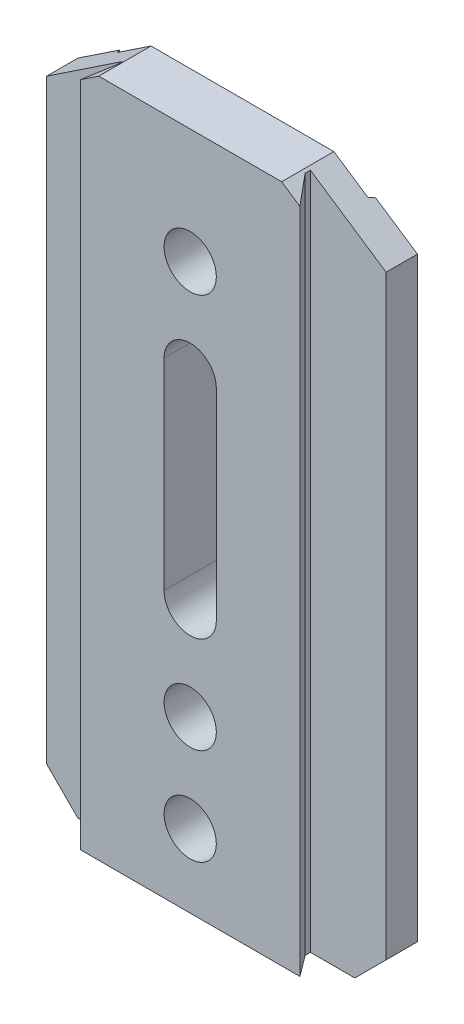
ISO-10303-21;
HEADER;
FILE_DESCRIPTION(('STEP AP214'),'2;1');
FILE_NAME('part.step','',(''),(''),'','','');
FILE_SCHEMA(('AUTOMOTIVE_DESIGN { 1 0 10303 214 1 1 1 1 }'));
ENDSEC;
DATA;
#1=APPLICATION_CONTEXT('core data for automotive mechanical design processes');
#2=APPLICATION_PROTOCOL_DEFINITION('international standard','automotive_design',2000,#1);
#3=PRODUCT_CONTEXT('',#1,'mechanical');
#4=PRODUCT('Part','Part','',(#3));
#5=PRODUCT_RELATED_PRODUCT_CATEGORY('part','',(#4));
#6=PRODUCT_DEFINITION_FORMATION('','',#4);
#7=PRODUCT_DEFINITION_CONTEXT('part definition',#1,'design');
#8=PRODUCT_DEFINITION('design','',#6,#7);
#9=PRODUCT_DEFINITION_SHAPE('','',#8);
#10=(LENGTH_UNIT() NAMED_UNIT(*) SI_UNIT(.MILLI.,.METRE.));
#11=(NAMED_UNIT(*) PLANE_ANGLE_UNIT() SI_UNIT($,.RADIAN.));
#12=(NAMED_UNIT(*) SI_UNIT($,.STERADIAN.) SOLID_ANGLE_UNIT());
#13=UNCERTAINTY_MEASURE_WITH_UNIT(LENGTH_MEASURE(1.E-05),#10,'distance_accuracy_value','');
#14=(GEOMETRIC_REPRESENTATION_CONTEXT(3) GLOBAL_UNCERTAINTY_ASSIGNED_CONTEXT((#13)) GLOBAL_UNIT_ASSIGNED_CONTEXT((#10,
#11,#12)) REPRESENTATION_CONTEXT('',''));
#15=CARTESIAN_POINT('',(0.,0.,0.));
#16=DIRECTION('',(0.,0.,1.));
#17=DIRECTION('',(1.,0.,0.));
#18=AXIS2_PLACEMENT_3D('',#15,#16,#17);
#19=CARTESIAN_POINT('',(0.,0.,0.));
#20=DIRECTION('',(0.,0.,1.));
#21=DIRECTION('',(1.,0.,0.));
#22=AXIS2_PLACEMENT_3D('',#19,#20,#21);
#23=PLANE('',#22);
#24=DIRECTION('',(0.832050294337844,0.554700196225229,0.));
#25=VECTOR('',#24,1.);
#26=CARTESIAN_POINT('',(-32.5,55.,0.));
#27=LINE('',#26,#25);
#28=CARTESIAN_POINT('',(-32.5,55.,0.));
#29=VERTEX_POINT('',#28);
#30=CARTESIAN_POINT('',(-24.5,60.3333333333333,0.));
#31=VERTEX_POINT('',#30);
#32=EDGE_CURVE('E209',#29,#31,#27,.T.);
#33=ORIENTED_EDGE('',*,*,#32,.T.);
#34=DIRECTION('',(0.,-1.,0.));
#35=VECTOR('',#34,1.);
#36=CARTESIAN_POINT('',(-24.5,65.,0.));
#37=LINE('',#36,#35);
#38=CARTESIAN_POINT('',(-24.5,-65.,0.));
#39=VERTEX_POINT('',#38);
#40=EDGE_CURVE('E196',#31,#39,#37,.T.);
#41=ORIENTED_EDGE('',*,*,#40,.T.);
#42=DIRECTION('',(1.,0.,0.));
#43=VECTOR('',#42,1.);
#44=CARTESIAN_POINT('',(-32.5,-65.,0.));
#45=LINE('',#44,#43);
#46=CARTESIAN_POINT('',(-26.5,-65.,0.));
#47=VERTEX_POINT('',#46);
#48=EDGE_CURVE('E207',#47,#39,#45,.T.);
#49=ORIENTED_EDGE('',*,*,#48,.F.);
#50=DIRECTION('',(-0.707106781186549,0.707106781186546,0.));
#51=VECTOR('',#50,1.);
#52=CARTESIAN_POINT('',(-26.5,-65.,0.));
#53=LINE('',#52,#51);
#54=CARTESIAN_POINT('',(-32.5,-59.,0.));
#55=VERTEX_POINT('',#54);
#56=EDGE_CURVE('E294',#47,#55,#53,.T.);
#57=ORIENTED_EDGE('',*,*,#56,.T.);
#58=DIRECTION('',(0.,-1.,0.));
#59=VECTOR('',#58,1.);
#60=CARTESIAN_POINT('',(-32.5,65.,0.));
#61=LINE('',#60,#59);
#62=EDGE_CURVE('E223',#29,#55,#61,.T.);
#63=ORIENTED_EDGE('',*,*,#62,.F.);
#64=EDGE_LOOP('',(#33,#41,#49,#57,#63));
#65=FACE_BOUND('',#64,.T.);
#66=ADVANCED_FACE('F45',(#65),#23,.F.);
#67=CARTESIAN_POINT('',(-32.5,65.,11.));
#68=DIRECTION('',(1.,0.,0.));
#69=DIRECTION('',(0.,1.,0.));
#70=AXIS2_PLACEMENT_3D('',#67,#68,#69);
#71=PLANE('',#70);
#72=ORIENTED_EDGE('',*,*,#62,.T.);
#73=DIRECTION('',(0.,0.,1.));
#74=VECTOR('',#73,1.);
#75=CARTESIAN_POINT('',(-32.5,-59.,0.));
#76=LINE('',#75,#74);
#77=CARTESIAN_POINT('',(-32.5,-59.,6.));
#78=VERTEX_POINT('',#77);
#79=EDGE_CURVE('E297',#55,#78,#76,.T.);
#80=ORIENTED_EDGE('',*,*,#79,.T.);
#81=DIRECTION('',(0.,1.,0.));
#82=VECTOR('',#81,1.);
#83=CARTESIAN_POINT('',(-32.5,-70.,6.));
#84=LINE('',#83,#82);
#85=CARTESIAN_POINT('',(-32.5,55.,6.));
#86=VERTEX_POINT('',#85);
#87=EDGE_CURVE('E343',#78,#86,#84,.T.);
#88=ORIENTED_EDGE('',*,*,#87,.T.);
#89=DIRECTION('',(0.,0.,1.));
#90=VECTOR('',#89,1.);
#91=CARTESIAN_POINT('',(-32.5,55.,0.));
#92=LINE('',#91,#90);
#93=EDGE_CURVE('E309',#29,#86,#92,.T.);
#94=ORIENTED_EDGE('',*,*,#93,.F.);
#95=EDGE_LOOP('',(#72,#80,#88,#94));
#96=FACE_BOUND('',#95,.T.);
#97=ADVANCED_FACE('F47',(#96),#71,.F.);
#98=CARTESIAN_POINT('',(-32.5,-65.,11.));
#99=DIRECTION('',(0.,1.,0.));
#100=DIRECTION('',(0.,0.,1.));
#101=AXIS2_PLACEMENT_3D('',#98,#99,#100);
#102=PLANE('',#101);
#103=ORIENTED_EDGE('',*,*,#48,.T.);
#104=DIRECTION('',(-0.447213595499988,0.,-0.894427190999901));
#105=VECTOR('',#104,1.);
#106=CARTESIAN_POINT('',(-24.5,-65.,0.));
#107=LINE('',#106,#105);
#108=CARTESIAN_POINT('',(-24.,-65.,1.));
#109=VERTEX_POINT('',#108);
#110=EDGE_CURVE('E193',#109,#39,#107,.T.);
#111=ORIENTED_EDGE('',*,*,#110,.F.);
#112=DIRECTION('',(-1.,0.,0.));
#113=VECTOR('',#112,1.);
#114=CARTESIAN_POINT('',(24.,-65.,1.));
#115=LINE('',#114,#113);
#116=CARTESIAN_POINT('',(24.,-65.,1.));
#117=VERTEX_POINT('',#116);
#118=EDGE_CURVE('E263',#117,#109,#115,.T.);
#119=ORIENTED_EDGE('',*,*,#118,.F.);
#120=DIRECTION('',(-0.447213595499958,0.,0.894427190999916));
#121=VECTOR('',#120,1.);
#122=CARTESIAN_POINT('',(24.5,-65.,0.));
#123=LINE('',#122,#121);
#124=CARTESIAN_POINT('',(24.5,-65.,0.));
#125=VERTEX_POINT('',#124);
#126=EDGE_CURVE('E201',#125,#117,#123,.T.);
#127=ORIENTED_EDGE('',*,*,#126,.F.);
#128=CARTESIAN_POINT('',(26.5,-65.,0.));
#129=VERTEX_POINT('',#128);
#130=EDGE_CURVE('E218',#125,#129,#45,.T.);
#131=ORIENTED_EDGE('',*,*,#130,.T.);
#132=DIRECTION('',(0.,0.,1.));
#133=VECTOR('',#132,1.);
#134=CARTESIAN_POINT('',(26.5,-65.,0.));
#135=LINE('',#134,#133);
#136=CARTESIAN_POINT('',(26.5,-65.,6.));
#137=VERTEX_POINT('',#136);
#138=EDGE_CURVE('E296',#129,#137,#135,.T.);
#139=ORIENTED_EDGE('',*,*,#138,.T.);
#140=DIRECTION('',(-1.,0.,0.));
#141=VECTOR('',#140,1.);
#142=CARTESIAN_POINT('',(-32.5,-65.,6.));
#143=LINE('',#142,#141);
#144=CARTESIAN_POINT('',(18.,-65.,6.));
#145=VERTEX_POINT('',#144);
#146=EDGE_CURVE('E360',#137,#145,#143,.T.);
#147=ORIENTED_EDGE('',*,*,#146,.T.);
#148=DIRECTION('',(0.,0.,1.));
#149=VECTOR('',#148,1.);
#150=CARTESIAN_POINT('',(18.,-65.,11.));
#151=LINE('',#150,#149);
#152=CARTESIAN_POINT('',(18.,-65.,7.));
#153=VERTEX_POINT('',#152);
#154=EDGE_CURVE('E362',#145,#153,#151,.T.);
#155=ORIENTED_EDGE('',*,*,#154,.T.);
#156=DIRECTION('',(0.6,0.,0.8));
#157=VECTOR('',#156,1.);
#158=CARTESIAN_POINT('',(1.74000000000002,-65.,-14.68));
#159=LINE('',#158,#157);
#160=CARTESIAN_POINT('',(21.,-65.,11.));
#161=VERTEX_POINT('',#160);
#162=EDGE_CURVE('E352',#153,#161,#159,.T.);
#163=ORIENTED_EDGE('',*,*,#162,.T.);
#164=DIRECTION('',(1.,0.,0.));
#165=VECTOR('',#164,1.);
#166=CARTESIAN_POINT('',(-32.5,-65.,11.));
#167=LINE('',#166,#165);
#168=CARTESIAN_POINT('',(-21.,-65.,11.));
#169=VERTEX_POINT('',#168);
#170=EDGE_CURVE('E221',#169,#161,#167,.T.);
#171=ORIENTED_EDGE('',*,*,#170,.F.);
#172=DIRECTION('',(0.6,0.,-0.8));
#173=VECTOR('',#172,1.);
#174=CARTESIAN_POINT('',(-25.14,-65.,16.52));
#175=LINE('',#174,#173);
#176=CARTESIAN_POINT('',(-18.,-65.,7.));
#177=VERTEX_POINT('',#176);
#178=EDGE_CURVE('E337',#169,#177,#175,.T.);
#179=ORIENTED_EDGE('',*,*,#178,.T.);
#180=DIRECTION('',(0.,0.,-1.));
#181=VECTOR('',#180,1.);
#182=CARTESIAN_POINT('',(-18.,-65.,11.));
#183=LINE('',#182,#181);
#184=CARTESIAN_POINT('',(-18.,-65.,6.));
#185=VERTEX_POINT('',#184);
#186=EDGE_CURVE('E355',#177,#185,#183,.T.);
#187=ORIENTED_EDGE('',*,*,#186,.T.);
#188=DIRECTION('',(-1.,0.,0.));
#189=VECTOR('',#188,1.);
#190=CARTESIAN_POINT('',(-32.5,-65.,6.));
#191=LINE('',#190,#189);
#192=CARTESIAN_POINT('',(-26.5,-65.,6.));
#193=VERTEX_POINT('',#192);
#194=EDGE_CURVE('E358',#185,#193,#191,.T.);
#195=ORIENTED_EDGE('',*,*,#194,.T.);
#196=DIRECTION('',(0.,0.,1.));
#197=VECTOR('',#196,1.);
#198=CARTESIAN_POINT('',(-26.5,-65.,0.));
#199=LINE('',#198,#197);
#200=EDGE_CURVE('E216',#47,#193,#199,.T.);
#201=ORIENTED_EDGE('',*,*,#200,.F.);
#202=EDGE_LOOP('',(#103,#111,#119,#127,#131,#139,#147,#155,#163,#171,#179,#187,#195,#201));
#203=FACE_BOUND('',#202,.T.);
#204=ADVANCED_FACE('F214',(#203),#102,.F.);
#205=CARTESIAN_POINT('',(32.5,65.,11.));
#206=DIRECTION('',(-1.,0.,0.));
#207=DIRECTION('',(0.,-1.,0.));
#208=AXIS2_PLACEMENT_3D('',#205,#206,#207);
#209=PLANE('',#208);
#210=DIRECTION('',(0.,1.,0.));
#211=VECTOR('',#210,1.);
#212=CARTESIAN_POINT('',(32.5,-70.,6.));
#213=LINE('',#212,#211);
#214=CARTESIAN_POINT('',(32.5,-59.,6.));
#215=VERTEX_POINT('',#214);
#216=CARTESIAN_POINT('',(32.5,55.,6.));
#217=VERTEX_POINT('',#216);
#218=EDGE_CURVE('E341',#215,#217,#213,.T.);
#219=ORIENTED_EDGE('',*,*,#218,.F.);
#220=DIRECTION('',(0.,0.,1.));
#221=VECTOR('',#220,1.);
#222=CARTESIAN_POINT('',(32.5,-59.,0.));
#223=LINE('',#222,#221);
#224=CARTESIAN_POINT('',(32.5,-59.,0.));
#225=VERTEX_POINT('',#224);
#226=EDGE_CURVE('E304',#225,#215,#223,.T.);
#227=ORIENTED_EDGE('',*,*,#226,.F.);
#228=DIRECTION('',(0.,1.,0.));
#229=VECTOR('',#228,1.);
#230=CARTESIAN_POINT('',(32.5,65.,0.));
#231=LINE('',#230,#229);
#232=CARTESIAN_POINT('',(32.5,55.,0.));
#233=VERTEX_POINT('',#232);
#234=EDGE_CURVE('E217',#225,#233,#231,.T.);
#235=ORIENTED_EDGE('',*,*,#234,.T.);
#236=DIRECTION('',(0.,0.,1.));
#237=VECTOR('',#236,1.);
#238=CARTESIAN_POINT('',(32.5,55.,0.));
#239=LINE('',#238,#237);
#240=EDGE_CURVE('E312',#233,#217,#239,.T.);
#241=ORIENTED_EDGE('',*,*,#240,.T.);
#242=EDGE_LOOP('',(#219,#227,#235,#241));
#243=FACE_BOUND('',#242,.T.);
#244=ADVANCED_FACE('F422',(#243),#209,.F.);
#245=CARTESIAN_POINT('',(-32.5,65.,11.));
#246=DIRECTION('',(0.,-1.,0.));
#247=DIRECTION('',(0.,0.,-1.));
#248=AXIS2_PLACEMENT_3D('',#245,#246,#247);
#249=PLANE('',#248);
#250=DIRECTION('',(0.,0.,1.));
#251=VECTOR('',#250,1.);
#252=CARTESIAN_POINT('',(17.5,65.,0.));
#253=LINE('',#252,#251);
#254=CARTESIAN_POINT('',(17.5,65.,1.));
#255=VERTEX_POINT('',#254);
#256=CARTESIAN_POINT('',(17.5,65.,11.));
#257=VERTEX_POINT('',#256);
#258=EDGE_CURVE('E262',#255,#257,#253,.T.);
#259=ORIENTED_EDGE('',*,*,#258,.F.);
#260=DIRECTION('',(-1.,0.,0.));
#261=VECTOR('',#260,1.);
#262=CARTESIAN_POINT('',(24.,65.,1.));
#263=LINE('',#262,#261);
#264=CARTESIAN_POINT('',(-17.5,65.,1.));
#265=VERTEX_POINT('',#264);
#266=EDGE_CURVE('E211',#255,#265,#263,.T.);
#267=ORIENTED_EDGE('',*,*,#266,.T.);
#268=DIRECTION('',(0.,0.,1.));
#269=VECTOR('',#268,1.);
#270=CARTESIAN_POINT('',(-17.5,65.,0.));
#271=LINE('',#270,#269);
#272=CARTESIAN_POINT('',(-17.5,65.,11.));
#273=VERTEX_POINT('',#272);
#274=EDGE_CURVE('E253',#265,#273,#271,.T.);
#275=ORIENTED_EDGE('',*,*,#274,.T.);
#276=DIRECTION('',(-1.,0.,0.));
#277=VECTOR('',#276,1.);
#278=CARTESIAN_POINT('',(-32.5,65.,11.));
#279=LINE('',#278,#277);
#280=EDGE_CURVE('E231',#257,#273,#279,.T.);
#281=ORIENTED_EDGE('',*,*,#280,.F.);
#282=EDGE_LOOP('',(#259,#267,#275,#281));
#283=FACE_BOUND('',#282,.T.);
#284=ADVANCED_FACE('F260',(#283),#249,.F.);
#285=CARTESIAN_POINT('',(0.,0.,11.));
#286=DIRECTION('',(0.,0.,1.));
#287=DIRECTION('',(1.,0.,0.));
#288=AXIS2_PLACEMENT_3D('',#285,#286,#287);
#289=PLANE('',#288);
#290=DIRECTION('',(0.832050294337844,0.554700196225229,0.));
#291=VECTOR('',#290,1.);
#292=CARTESIAN_POINT('',(-32.5,55.,11.));
#293=LINE('',#292,#291);
#294=CARTESIAN_POINT('',(-21.,62.6666666666667,11.));
#295=VERTEX_POINT('',#294);
#296=EDGE_CURVE('E310',#295,#273,#293,.T.);
#297=ORIENTED_EDGE('',*,*,#296,.F.);
#298=DIRECTION('',(0.,1.,0.));
#299=VECTOR('',#298,1.);
#300=CARTESIAN_POINT('',(-21.,0.,11.));
#301=LINE('',#300,#299);
#302=EDGE_CURVE('E227',#169,#295,#301,.T.);
#303=ORIENTED_EDGE('',*,*,#302,.F.);
#304=ORIENTED_EDGE('',*,*,#170,.T.);
#305=DIRECTION('',(0.,-1.,0.));
#306=VECTOR('',#305,1.);
#307=CARTESIAN_POINT('',(21.,0.,11.));
#308=LINE('',#307,#306);
#309=CARTESIAN_POINT('',(21.,62.6666666666667,11.));
#310=VERTEX_POINT('',#309);
#311=EDGE_CURVE('E230',#310,#161,#308,.T.);
#312=ORIENTED_EDGE('',*,*,#311,.F.);
#313=DIRECTION('',(0.832050294337844,-0.554700196225228,0.));
#314=VECTOR('',#313,1.);
#315=CARTESIAN_POINT('',(17.5,65.,11.));
#316=LINE('',#315,#314);
#317=EDGE_CURVE('E300',#257,#310,#316,.T.);
#318=ORIENTED_EDGE('',*,*,#317,.F.);
#319=ORIENTED_EDGE('',*,*,#280,.T.);
#320=EDGE_LOOP('',(#297,#303,#304,#312,#318,#319));
#321=FACE_BOUND('',#320,.T.);
#322=CARTESIAN_POINT('',(0.,-51.,11.));
#323=DIRECTION('',(0.,0.,1.));
#324=DIRECTION('',(1.,0.,0.));
#325=AXIS2_PLACEMENT_3D('',#322,#323,#324);
#326=CIRCLE('',#325,5.);
#327=CARTESIAN_POINT('',(5.,-51.,11.));
#328=VERTEX_POINT('',#327);
#329=EDGE_CURVE('E366',#328,#328,#326,.T.);
#330=ORIENTED_EDGE('',*,*,#329,.F.);
#331=EDGE_LOOP('',(#330));
#332=FACE_BOUND('',#331,.T.);
#333=CARTESIAN_POINT('',(0.,-14.,11.));
#334=DIRECTION('',(0.,0.,1.));
#335=DIRECTION('',(1.,0.,0.));
#336=AXIS2_PLACEMENT_3D('',#333,#334,#335);
#337=CIRCLE('',#336,5.);
#338=CARTESIAN_POINT('',(-5.,-14.,11.));
#339=VERTEX_POINT('',#338);
#340=CARTESIAN_POINT('',(5.,-14.,11.));
#341=VERTEX_POINT('',#340);
#342=EDGE_CURVE('E365',#339,#341,#337,.T.);
#343=ORIENTED_EDGE('',*,*,#342,.F.);
#344=DIRECTION('',(0.,-1.,0.));
#345=VECTOR('',#344,1.);
#346=CARTESIAN_POINT('',(-5.,-14.,11.));
#347=LINE('',#346,#345);
#348=CARTESIAN_POINT('',(-5.,24.5,11.));
#349=VERTEX_POINT('',#348);
#350=EDGE_CURVE('E378',#349,#339,#347,.T.);
#351=ORIENTED_EDGE('',*,*,#350,.F.);
#352=CARTESIAN_POINT('',(0.,24.5,11.));
#353=DIRECTION('',(0.,0.,1.));
#354=DIRECTION('',(1.,0.,0.));
#355=AXIS2_PLACEMENT_3D('',#352,#353,#354);
#356=CIRCLE('',#355,5.);
#357=CARTESIAN_POINT('',(5.,24.5,11.));
#358=VERTEX_POINT('',#357);
#359=EDGE_CURVE('E375',#358,#349,#356,.T.);
#360=ORIENTED_EDGE('',*,*,#359,.F.);
#361=DIRECTION('',(0.,1.,0.));
#362=VECTOR('',#361,1.);
#363=CARTESIAN_POINT('',(5.,-14.,11.));
#364=LINE('',#363,#362);
#365=EDGE_CURVE('E372',#341,#358,#364,.T.);
#366=ORIENTED_EDGE('',*,*,#365,.F.);
#367=EDGE_LOOP('',(#343,#351,#360,#366));
#368=FACE_BOUND('',#367,.T.);
#369=CARTESIAN_POINT('',(0.,43.,11.));
#370=DIRECTION('',(0.,0.,1.));
#371=DIRECTION('',(1.,0.,0.));
#372=AXIS2_PLACEMENT_3D('',#369,#370,#371);
#373=CIRCLE('',#372,5.);
#374=CARTESIAN_POINT('',(5.,43.,11.));
#375=VERTEX_POINT('',#374);
#376=EDGE_CURVE('E384',#375,#375,#373,.T.);
#377=ORIENTED_EDGE('',*,*,#376,.F.);
#378=EDGE_LOOP('',(#377));
#379=FACE_BOUND('',#378,.T.);
#380=CARTESIAN_POINT('',(0.,-32.5,11.));
#381=DIRECTION('',(0.,0.,1.));
#382=DIRECTION('',(1.,0.,0.));
#383=AXIS2_PLACEMENT_3D('',#380,#381,#382);
#384=CIRCLE('',#383,5.);
#385=CARTESIAN_POINT('',(5.,-32.5,11.));
#386=VERTEX_POINT('',#385);
#387=EDGE_CURVE('E369',#386,#386,#384,.T.);
#388=ORIENTED_EDGE('',*,*,#387,.F.);
#389=EDGE_LOOP('',(#388));
#390=FACE_BOUND('',#389,.T.);
#391=ADVANCED_FACE('F399',(#321,#332,#368,#379,#390),#289,.T.);
#392=ORIENTED_EDGE('',*,*,#130,.F.);
#393=DIRECTION('',(0.,-1.,0.));
#394=VECTOR('',#393,1.);
#395=CARTESIAN_POINT('',(24.5,65.,0.));
#396=LINE('',#395,#394);
#397=CARTESIAN_POINT('',(24.5,60.3333333333333,0.));
#398=VERTEX_POINT('',#397);
#399=EDGE_CURVE('E210',#398,#125,#396,.T.);
#400=ORIENTED_EDGE('',*,*,#399,.F.);
#401=DIRECTION('',(0.832050294337844,-0.554700196225228,0.));
#402=VECTOR('',#401,1.);
#403=CARTESIAN_POINT('',(17.5,65.,0.));
#404=LINE('',#403,#402);
#405=EDGE_CURVE('E316',#398,#233,#404,.T.);
#406=ORIENTED_EDGE('',*,*,#405,.T.);
#407=ORIENTED_EDGE('',*,*,#234,.F.);
#408=DIRECTION('',(-0.707106781186548,-0.707106781186548,0.));
#409=VECTOR('',#408,1.);
#410=CARTESIAN_POINT('',(26.5,-65.,0.));
#411=LINE('',#410,#409);
#412=EDGE_CURVE('E293',#225,#129,#411,.T.);
#413=ORIENTED_EDGE('',*,*,#412,.T.);
#414=EDGE_LOOP('',(#392,#400,#406,#407,#413));
#415=FACE_BOUND('',#414,.T.);
#416=ADVANCED_FACE('F427',(#415),#23,.F.);
#417=CARTESIAN_POINT('',(0.,-32.5,0.));
#418=DIRECTION('',(0.,0.,1.));
#419=DIRECTION('',(1.,0.,0.));
#420=AXIS2_PLACEMENT_3D('',#417,#418,#419);
#421=CYLINDRICAL_SURFACE('',#420,5.);
#422=CARTESIAN_POINT('',(0.,-32.5,1.));
#423=DIRECTION('',(0.,0.,1.));
#424=DIRECTION('',(1.,0.,0.));
#425=AXIS2_PLACEMENT_3D('',#422,#423,#424);
#426=CIRCLE('',#425,5.);
#427=CARTESIAN_POINT('',(5.,-32.5,1.));
#428=VERTEX_POINT('',#427);
#429=EDGE_CURVE('E290',#428,#428,#426,.F.);
#430=ORIENTED_EDGE('',*,*,#429,.T.);
#431=EDGE_LOOP('',(#430));
#432=FACE_BOUND('',#431,.T.);
#433=ORIENTED_EDGE('',*,*,#387,.T.);
#434=EDGE_LOOP('',(#433));
#435=FACE_BOUND('',#434,.T.);
#436=ADVANCED_FACE('F454',(#432,#435),#421,.F.);
#437=CARTESIAN_POINT('',(0.,43.,0.));
#438=DIRECTION('',(0.,0.,1.));
#439=DIRECTION('',(1.,0.,0.));
#440=AXIS2_PLACEMENT_3D('',#437,#438,#439);
#441=CYLINDRICAL_SURFACE('',#440,5.);
#442=CARTESIAN_POINT('',(0.,43.,1.));
#443=DIRECTION('',(0.,0.,1.));
#444=DIRECTION('',(1.,0.,0.));
#445=AXIS2_PLACEMENT_3D('',#442,#443,#444);
#446=CIRCLE('',#445,5.);
#447=CARTESIAN_POINT('',(5.,43.,1.));
#448=VERTEX_POINT('',#447);
#449=EDGE_CURVE('E287',#448,#448,#446,.F.);
#450=ORIENTED_EDGE('',*,*,#449,.T.);
#451=EDGE_LOOP('',(#450));
#452=FACE_BOUND('',#451,.T.);
#453=ORIENTED_EDGE('',*,*,#376,.T.);
#454=EDGE_LOOP('',(#453));
#455=FACE_BOUND('',#454,.T.);
#456=ADVANCED_FACE('F459',(#452,#455),#441,.F.);
#457=CARTESIAN_POINT('',(0.,-14.,0.));
#458=DIRECTION('',(0.,0.,1.));
#459=DIRECTION('',(1.,0.,0.));
#460=AXIS2_PLACEMENT_3D('',#457,#458,#459);
#461=CYLINDRICAL_SURFACE('',#460,5.);
#462=DIRECTION('',(0.,0.,1.));
#463=VECTOR('',#462,1.);
#464=CARTESIAN_POINT('',(5.,-14.,0.));
#465=LINE('',#464,#463);
#466=CARTESIAN_POINT('',(5.,-14.,1.));
#467=VERTEX_POINT('',#466);
#468=EDGE_CURVE('E381',#467,#341,#465,.T.);
#469=ORIENTED_EDGE('',*,*,#468,.F.);
#470=CARTESIAN_POINT('',(0.,-14.,1.));
#471=DIRECTION('',(0.,0.,1.));
#472=DIRECTION('',(1.,0.,0.));
#473=AXIS2_PLACEMENT_3D('',#470,#471,#472);
#474=CIRCLE('',#473,5.);
#475=CARTESIAN_POINT('',(-5.,-14.,1.));
#476=VERTEX_POINT('',#475);
#477=EDGE_CURVE('E60',#467,#476,#474,.F.);
#478=ORIENTED_EDGE('',*,*,#477,.T.);
#479=DIRECTION('',(0.,0.,1.));
#480=VECTOR('',#479,1.);
#481=CARTESIAN_POINT('',(-5.,-14.,0.));
#482=LINE('',#481,#480);
#483=EDGE_CURVE('E382',#476,#339,#482,.T.);
#484=ORIENTED_EDGE('',*,*,#483,.T.);
#485=ORIENTED_EDGE('',*,*,#342,.T.);
#486=EDGE_LOOP('',(#469,#478,#484,#485));
#487=FACE_BOUND('',#486,.T.);
#488=ADVANCED_FACE('F467',(#487),#461,.F.);
#489=CARTESIAN_POINT('',(-5.,-14.,0.));
#490=DIRECTION('',(-1.,0.,0.));
#491=DIRECTION('',(0.,0.,1.));
#492=AXIS2_PLACEMENT_3D('',#489,#490,#491);
#493=PLANE('',#492);
#494=ORIENTED_EDGE('',*,*,#483,.F.);
#495=DIRECTION('',(0.,1.,0.));
#496=VECTOR('',#495,1.);
#497=CARTESIAN_POINT('',(-5.,-14.,1.));
#498=LINE('',#497,#496);
#499=CARTESIAN_POINT('',(-5.,24.5,1.));
#500=VERTEX_POINT('',#499);
#501=EDGE_CURVE('E283',#476,#500,#498,.T.);
#502=ORIENTED_EDGE('',*,*,#501,.T.);
#503=DIRECTION('',(0.,0.,1.));
#504=VECTOR('',#503,1.);
#505=CARTESIAN_POINT('',(-5.,24.5,0.));
#506=LINE('',#505,#504);
#507=EDGE_CURVE('E385',#500,#349,#506,.T.);
#508=ORIENTED_EDGE('',*,*,#507,.T.);
#509=ORIENTED_EDGE('',*,*,#350,.T.);
#510=EDGE_LOOP('',(#494,#502,#508,#509));
#511=FACE_BOUND('',#510,.T.);
#512=ADVANCED_FACE('F472',(#511),#493,.F.);
#513=CARTESIAN_POINT('',(0.,24.5,0.));
#514=DIRECTION('',(0.,0.,1.));
#515=DIRECTION('',(1.,0.,0.));
#516=AXIS2_PLACEMENT_3D('',#513,#514,#515);
#517=CYLINDRICAL_SURFACE('',#516,5.);
#518=ORIENTED_EDGE('',*,*,#507,.F.);
#519=CARTESIAN_POINT('',(0.,24.5,1.));
#520=DIRECTION('',(0.,0.,1.));
#521=DIRECTION('',(1.,0.,0.));
#522=AXIS2_PLACEMENT_3D('',#519,#520,#521);
#523=CIRCLE('',#522,5.);
#524=CARTESIAN_POINT('',(5.,24.5,1.));
#525=VERTEX_POINT('',#524);
#526=EDGE_CURVE('E280',#500,#525,#523,.F.);
#527=ORIENTED_EDGE('',*,*,#526,.T.);
#528=DIRECTION('',(0.,0.,1.));
#529=VECTOR('',#528,1.);
#530=CARTESIAN_POINT('',(5.,24.5,0.));
#531=LINE('',#530,#529);
#532=EDGE_CURVE('E387',#525,#358,#531,.T.);
#533=ORIENTED_EDGE('',*,*,#532,.T.);
#534=ORIENTED_EDGE('',*,*,#359,.T.);
#535=EDGE_LOOP('',(#518,#527,#533,#534));
#536=FACE_BOUND('',#535,.T.);
#537=ADVANCED_FACE('F478',(#536),#517,.F.);
#538=CARTESIAN_POINT('',(5.,-14.,0.));
#539=DIRECTION('',(1.,0.,0.));
#540=DIRECTION('',(0.,0.,-1.));
#541=AXIS2_PLACEMENT_3D('',#538,#539,#540);
#542=PLANE('',#541);
#543=ORIENTED_EDGE('',*,*,#532,.F.);
#544=DIRECTION('',(0.,-1.,0.));
#545=VECTOR('',#544,1.);
#546=CARTESIAN_POINT('',(5.,-14.,1.));
#547=LINE('',#546,#545);
#548=EDGE_CURVE('E278',#525,#467,#547,.T.);
#549=ORIENTED_EDGE('',*,*,#548,.T.);
#550=ORIENTED_EDGE('',*,*,#468,.T.);
#551=ORIENTED_EDGE('',*,*,#365,.T.);
#552=EDGE_LOOP('',(#543,#549,#550,#551));
#553=FACE_BOUND('',#552,.T.);
#554=ADVANCED_FACE('F474',(#553),#542,.F.);
#555=CARTESIAN_POINT('',(0.,-51.,0.));
#556=DIRECTION('',(0.,0.,1.));
#557=DIRECTION('',(1.,0.,0.));
#558=AXIS2_PLACEMENT_3D('',#555,#556,#557);
#559=CYLINDRICAL_SURFACE('',#558,5.);
#560=CARTESIAN_POINT('',(0.,-51.,1.));
#561=DIRECTION('',(0.,0.,1.));
#562=DIRECTION('',(1.,0.,0.));
#563=AXIS2_PLACEMENT_3D('',#560,#561,#562);
#564=CIRCLE('',#563,5.);
#565=CARTESIAN_POINT('',(5.,-51.,1.));
#566=VERTEX_POINT('',#565);
#567=EDGE_CURVE('E275',#566,#566,#564,.F.);
#568=ORIENTED_EDGE('',*,*,#567,.T.);
#569=EDGE_LOOP('',(#568));
#570=FACE_BOUND('',#569,.T.);
#571=ORIENTED_EDGE('',*,*,#329,.T.);
#572=EDGE_LOOP('',(#571));
#573=FACE_BOUND('',#572,.T.);
#574=ADVANCED_FACE('F477',(#570,#573),#559,.F.);
#575=CARTESIAN_POINT('',(-18.,-70.,6.));
#576=DIRECTION('',(0.,0.,-1.));
#577=DIRECTION('',(-1.,0.,0.));
#578=AXIS2_PLACEMENT_3D('',#575,#576,#577);
#579=PLANE('',#578);
#580=ORIENTED_EDGE('',*,*,#87,.F.);
#581=DIRECTION('',(0.707106781186549,-0.707106781186546,0.));
#582=VECTOR('',#581,1.);
#583=CARTESIAN_POINT('',(-19.75,-71.75,6.));
#584=LINE('',#583,#582);
#585=EDGE_CURVE('E242',#78,#193,#584,.T.);
#586=ORIENTED_EDGE('',*,*,#585,.T.);
#587=ORIENTED_EDGE('',*,*,#194,.F.);
#588=DIRECTION('',(0.,1.,0.));
#589=VECTOR('',#588,1.);
#590=CARTESIAN_POINT('',(-18.,-70.,6.));
#591=LINE('',#590,#589);
#592=CARTESIAN_POINT('',(-18.,64.6666666666667,6.));
#593=VERTEX_POINT('',#592);
#594=EDGE_CURVE('E345',#185,#593,#591,.T.);
#595=ORIENTED_EDGE('',*,*,#594,.T.);
#596=DIRECTION('',(-0.832050294337844,-0.554700196225229,0.));
#597=VECTOR('',#596,1.);
#598=CARTESIAN_POINT('',(-80.1538461538462,23.2307692307693,6.));
#599=LINE('',#598,#597);
#600=EDGE_CURVE('E330',#593,#86,#599,.T.);
#601=ORIENTED_EDGE('',*,*,#600,.T.);
#602=EDGE_LOOP('',(#580,#586,#587,#595,#601));
#603=FACE_BOUND('',#602,.T.);
#604=ADVANCED_FACE('F488',(#603),#579,.F.);
#605=CARTESIAN_POINT('',(-18.,-70.,7.));
#606=DIRECTION('',(1.,0.,0.));
#607=DIRECTION('',(0.,0.,-1.));
#608=AXIS2_PLACEMENT_3D('',#605,#606,#607);
#609=PLANE('',#608);
#610=DIRECTION('',(0.,1.,0.));
#611=VECTOR('',#610,1.);
#612=CARTESIAN_POINT('',(-18.,-70.,7.));
#613=LINE('',#612,#611);
#614=CARTESIAN_POINT('',(-18.,64.6666666666667,7.));
#615=VERTEX_POINT('',#614);
#616=EDGE_CURVE('E333',#177,#615,#613,.T.);
#617=ORIENTED_EDGE('',*,*,#616,.T.);
#618=DIRECTION('',(0.,0.,-1.));
#619=VECTOR('',#618,1.);
#620=CARTESIAN_POINT('',(-18.,64.6666666666667,7.));
#621=LINE('',#620,#619);
#622=EDGE_CURVE('E327',#615,#593,#621,.T.);
#623=ORIENTED_EDGE('',*,*,#622,.T.);
#624=ORIENTED_EDGE('',*,*,#594,.F.);
#625=ORIENTED_EDGE('',*,*,#186,.F.);
#626=EDGE_LOOP('',(#617,#623,#624,#625));
#627=FACE_BOUND('',#626,.T.);
#628=ADVANCED_FACE('F493',(#627),#609,.F.);
#629=CARTESIAN_POINT('',(-21.,-70.,11.));
#630=DIRECTION('',(0.8,0.,0.6));
#631=DIRECTION('',(0.6,0.,-0.8));
#632=AXIS2_PLACEMENT_3D('',#629,#630,#631);
#633=PLANE('',#632);
#634=ORIENTED_EDGE('',*,*,#302,.T.);
#635=DIRECTION('',(0.557086014531155,0.371390676354104,-0.742781352708207));
#636=VECTOR('',#635,1.);
#637=CARTESIAN_POINT('',(-48.448275862069,44.367816091954,47.5977011494253));
#638=LINE('',#637,#636);
#639=EDGE_CURVE('E236',#295,#615,#638,.T.);
#640=ORIENTED_EDGE('',*,*,#639,.T.);
#641=ORIENTED_EDGE('',*,*,#616,.F.);
#642=ORIENTED_EDGE('',*,*,#178,.F.);
#643=EDGE_LOOP('',(#634,#640,#641,#642));
#644=FACE_BOUND('',#643,.T.);
#645=ADVANCED_FACE('F490',(#644),#633,.F.);
#646=CARTESIAN_POINT('',(18.,-70.,7.));
#647=DIRECTION('',(-1.,0.,0.));
#648=DIRECTION('',(0.,0.,1.));
#649=AXIS2_PLACEMENT_3D('',#646,#647,#648);
#650=PLANE('',#649);
#651=DIRECTION('',(0.,1.,0.));
#652=VECTOR('',#651,1.);
#653=CARTESIAN_POINT('',(18.,-70.,6.));
#654=LINE('',#653,#652);
#655=CARTESIAN_POINT('',(18.,64.6666666666667,6.));
#656=VERTEX_POINT('',#655);
#657=EDGE_CURVE('E338',#145,#656,#654,.T.);
#658=ORIENTED_EDGE('',*,*,#657,.T.);
#659=DIRECTION('',(0.,0.,1.));
#660=VECTOR('',#659,1.);
#661=CARTESIAN_POINT('',(18.,64.6666666666667,7.));
#662=LINE('',#661,#660);
#663=CARTESIAN_POINT('',(18.,64.6666666666667,6.99999999999999));
#664=VERTEX_POINT('',#663);
#665=EDGE_CURVE('E314',#656,#664,#662,.T.);
#666=ORIENTED_EDGE('',*,*,#665,.T.);
#667=DIRECTION('',(0.,1.,0.));
#668=VECTOR('',#667,1.);
#669=CARTESIAN_POINT('',(18.,-70.,7.));
#670=LINE('',#669,#668);
#671=EDGE_CURVE('E334',#153,#664,#670,.T.);
#672=ORIENTED_EDGE('',*,*,#671,.F.);
#673=ORIENTED_EDGE('',*,*,#154,.F.);
#674=EDGE_LOOP('',(#658,#666,#672,#673));
#675=FACE_BOUND('',#674,.T.);
#676=ADVANCED_FACE('F410',(#675),#650,.F.);
#677=CARTESIAN_POINT('',(18.,-70.,6.));
#678=DIRECTION('',(0.,0.,-1.));
#679=DIRECTION('',(-1.,0.,0.));
#680=AXIS2_PLACEMENT_3D('',#677,#678,#679);
#681=PLANE('',#680);
#682=ORIENTED_EDGE('',*,*,#146,.F.);
#683=DIRECTION('',(0.707106781186548,0.707106781186548,0.));
#684=VECTOR('',#683,1.);
#685=CARTESIAN_POINT('',(19.75,-71.75,6.));
#686=LINE('',#685,#684);
#687=EDGE_CURVE('E239',#137,#215,#686,.T.);
#688=ORIENTED_EDGE('',*,*,#687,.T.);
#689=ORIENTED_EDGE('',*,*,#218,.T.);
#690=DIRECTION('',(-0.832050294337844,0.554700196225228,0.));
#691=VECTOR('',#690,1.);
#692=CARTESIAN_POINT('',(80.1538461538461,23.2307692307693,6.));
#693=LINE('',#692,#691);
#694=EDGE_CURVE('E324',#217,#656,#693,.T.);
#695=ORIENTED_EDGE('',*,*,#694,.T.);
#696=ORIENTED_EDGE('',*,*,#657,.F.);
#697=EDGE_LOOP('',(#682,#688,#689,#695,#696));
#698=FACE_BOUND('',#697,.T.);
#699=ADVANCED_FACE('F416',(#698),#681,.F.);
#700=CARTESIAN_POINT('',(21.,-70.,11.));
#701=DIRECTION('',(-0.8,0.,0.6));
#702=DIRECTION('',(0.6,0.,0.8));
#703=AXIS2_PLACEMENT_3D('',#700,#701,#702);
#704=PLANE('',#703);
#705=ORIENTED_EDGE('',*,*,#671,.T.);
#706=DIRECTION('',(0.557086014531156,-0.371390676354103,0.742781352708208));
#707=VECTOR('',#706,1.);
#708=CARTESIAN_POINT('',(48.4482758620689,44.3678160919541,47.5977011494252));
#709=LINE('',#708,#707);
#710=EDGE_CURVE('E233',#664,#310,#709,.T.);
#711=ORIENTED_EDGE('',*,*,#710,.T.);
#712=ORIENTED_EDGE('',*,*,#311,.T.);
#713=ORIENTED_EDGE('',*,*,#162,.F.);
#714=EDGE_LOOP('',(#705,#711,#712,#713));
#715=FACE_BOUND('',#714,.T.);
#716=ADVANCED_FACE('F406',(#715),#704,.F.);
#717=CARTESIAN_POINT('',(17.5,65.,0.));
#718=DIRECTION('',(-0.554700196225228,-0.832050294337844,0.));
#719=DIRECTION('',(0.832050294337844,-0.554700196225228,0.));
#720=AXIS2_PLACEMENT_3D('',#717,#718,#719);
#721=PLANE('',#720);
#722=DIRECTION('',(-0.428571428571429,0.285714285714285,0.857142857142857));
#723=VECTOR('',#722,1.);
#724=CARTESIAN_POINT('',(22.6428571428572,61.5714285714286,3.71428571428573));
#725=LINE('',#724,#723);
#726=CARTESIAN_POINT('',(24.,60.6666666666667,1.));
#727=VERTEX_POINT('',#726);
#728=EDGE_CURVE('E13',#398,#727,#725,.T.);
#729=ORIENTED_EDGE('',*,*,#728,.T.);
#730=DIRECTION('',(-0.832050294337844,0.554700196225228,0.));
#731=VECTOR('',#730,1.);
#732=CARTESIAN_POINT('',(17.5,65.,1.));
#733=LINE('',#732,#731);
#734=EDGE_CURVE('E270',#727,#255,#733,.T.);
#735=ORIENTED_EDGE('',*,*,#734,.T.);
#736=ORIENTED_EDGE('',*,*,#258,.T.);
#737=ORIENTED_EDGE('',*,*,#317,.T.);
#738=ORIENTED_EDGE('',*,*,#710,.F.);
#739=ORIENTED_EDGE('',*,*,#665,.F.);
#740=ORIENTED_EDGE('',*,*,#694,.F.);
#741=ORIENTED_EDGE('',*,*,#240,.F.);
#742=ORIENTED_EDGE('',*,*,#405,.F.);
#743=EDGE_LOOP('',(#729,#735,#736,#737,#738,#739,#740,#741,#742));
#744=FACE_BOUND('',#743,.T.);
#745=ADVANCED_FACE('F404',(#744),#721,.F.);
#746=CARTESIAN_POINT('',(-32.5,55.,0.));
#747=DIRECTION('',(0.554700196225229,-0.832050294337844,0.));
#748=DIRECTION('',(0.832050294337844,0.554700196225229,0.));
#749=AXIS2_PLACEMENT_3D('',#746,#747,#748);
#750=PLANE('',#749);
#751=DIRECTION('',(-0.832050294337844,-0.554700196225229,0.));
#752=VECTOR('',#751,1.);
#753=CARTESIAN_POINT('',(-32.5,55.,1.));
#754=LINE('',#753,#752);
#755=CARTESIAN_POINT('',(-24.,60.6666666666667,1.));
#756=VERTEX_POINT('',#755);
#757=EDGE_CURVE('E245',#265,#756,#754,.T.);
#758=ORIENTED_EDGE('',*,*,#757,.T.);
#759=DIRECTION('',(-0.428571428571455,-0.285714285714303,-0.857142857142838));
#760=VECTOR('',#759,1.);
#761=CARTESIAN_POINT('',(-26.6224489795921,58.9183673469386,-4.24489795918384));
#762=LINE('',#761,#760);
#763=EDGE_CURVE('E53',#756,#31,#762,.T.);
#764=ORIENTED_EDGE('',*,*,#763,.T.);
#765=ORIENTED_EDGE('',*,*,#32,.F.);
#766=ORIENTED_EDGE('',*,*,#93,.T.);
#767=ORIENTED_EDGE('',*,*,#600,.F.);
#768=ORIENTED_EDGE('',*,*,#622,.F.);
#769=ORIENTED_EDGE('',*,*,#639,.F.);
#770=ORIENTED_EDGE('',*,*,#296,.T.);
#771=ORIENTED_EDGE('',*,*,#274,.F.);
#772=EDGE_LOOP('',(#758,#764,#765,#766,#767,#768,#769,#770,#771));
#773=FACE_BOUND('',#772,.T.);
#774=ADVANCED_FACE('F248',(#773),#750,.F.);
#775=CARTESIAN_POINT('',(26.5,-65.,0.));
#776=DIRECTION('',(-0.707106781186548,0.707106781186548,0.));
#777=DIRECTION('',(-0.707106781186548,-0.707106781186548,0.));
#778=AXIS2_PLACEMENT_3D('',#775,#776,#777);
#779=PLANE('',#778);
#780=ORIENTED_EDGE('',*,*,#138,.F.);
#781=ORIENTED_EDGE('',*,*,#412,.F.);
#782=ORIENTED_EDGE('',*,*,#226,.T.);
#783=ORIENTED_EDGE('',*,*,#687,.F.);
#784=EDGE_LOOP('',(#780,#781,#782,#783));
#785=FACE_BOUND('',#784,.T.);
#786=ADVANCED_FACE('F434',(#785),#779,.F.);
#787=CARTESIAN_POINT('',(-26.5,-65.,0.));
#788=DIRECTION('',(0.707106781186546,0.707106781186549,0.));
#789=DIRECTION('',(-0.707106781186549,0.707106781186546,0.));
#790=AXIS2_PLACEMENT_3D('',#787,#788,#789);
#791=PLANE('',#790);
#792=ORIENTED_EDGE('',*,*,#79,.F.);
#793=ORIENTED_EDGE('',*,*,#56,.F.);
#794=ORIENTED_EDGE('',*,*,#200,.T.);
#795=ORIENTED_EDGE('',*,*,#585,.F.);
#796=EDGE_LOOP('',(#792,#793,#794,#795));
#797=FACE_BOUND('',#796,.T.);
#798=ADVANCED_FACE('F436',(#797),#791,.F.);
#799=CARTESIAN_POINT('',(24.5,65.,0.));
#800=DIRECTION('',(0.894427190999916,0.,0.447213595499958));
#801=DIRECTION('',(0.447213595499958,0.,-0.894427190999916));
#802=AXIS2_PLACEMENT_3D('',#799,#800,#801);
#803=PLANE('',#802);
#804=ORIENTED_EDGE('',*,*,#399,.T.);
#805=ORIENTED_EDGE('',*,*,#126,.T.);
#806=DIRECTION('',(0.,-1.,0.));
#807=VECTOR('',#806,1.);
#808=CARTESIAN_POINT('',(24.,65.,1.));
#809=LINE('',#808,#807);
#810=EDGE_CURVE('E271',#727,#117,#809,.T.);
#811=ORIENTED_EDGE('',*,*,#810,.F.);
#812=ORIENTED_EDGE('',*,*,#728,.F.);
#813=EDGE_LOOP('',(#804,#805,#811,#812));
#814=FACE_BOUND('',#813,.T.);
#815=ADVANCED_FACE('F431',(#814),#803,.F.);
#816=CARTESIAN_POINT('',(-24.5,65.,0.));
#817=DIRECTION('',(-0.894427190999901,0.,0.447213595499988));
#818=DIRECTION('',(0.447213595499988,0.,0.894427190999901));
#819=AXIS2_PLACEMENT_3D('',#816,#817,#818);
#820=PLANE('',#819);
#821=DIRECTION('',(0.,-1.,0.));
#822=VECTOR('',#821,1.);
#823=CARTESIAN_POINT('',(-24.,65.,1.));
#824=LINE('',#823,#822);
#825=EDGE_CURVE('E68',#756,#109,#824,.T.);
#826=ORIENTED_EDGE('',*,*,#825,.T.);
#827=ORIENTED_EDGE('',*,*,#110,.T.);
#828=ORIENTED_EDGE('',*,*,#40,.F.);
#829=ORIENTED_EDGE('',*,*,#763,.F.);
#830=EDGE_LOOP('',(#826,#827,#828,#829));
#831=FACE_BOUND('',#830,.T.);
#832=ADVANCED_FACE('F195',(#831),#820,.F.);
#833=CARTESIAN_POINT('',(24.,65.,1.));
#834=DIRECTION('',(0.,0.,1.));
#835=DIRECTION('',(1.,0.,0.));
#836=AXIS2_PLACEMENT_3D('',#833,#834,#835);
#837=PLANE('',#836);
#838=ORIENTED_EDGE('',*,*,#449,.F.);
#839=EDGE_LOOP('',(#838));
#840=FACE_BOUND('',#839,.T.);
#841=ORIENTED_EDGE('',*,*,#810,.T.);
#842=ORIENTED_EDGE('',*,*,#118,.T.);
#843=ORIENTED_EDGE('',*,*,#825,.F.);
#844=ORIENTED_EDGE('',*,*,#757,.F.);
#845=ORIENTED_EDGE('',*,*,#266,.F.);
#846=ORIENTED_EDGE('',*,*,#734,.F.);
#847=EDGE_LOOP('',(#841,#842,#843,#844,#845,#846));
#848=FACE_BOUND('',#847,.T.);
#849=ORIENTED_EDGE('',*,*,#567,.F.);
#850=EDGE_LOOP('',(#849));
#851=FACE_BOUND('',#850,.T.);
#852=ORIENTED_EDGE('',*,*,#548,.F.);
#853=ORIENTED_EDGE('',*,*,#526,.F.);
#854=ORIENTED_EDGE('',*,*,#501,.F.);
#855=ORIENTED_EDGE('',*,*,#477,.F.);
#856=EDGE_LOOP('',(#852,#853,#854,#855));
#857=FACE_BOUND('',#856,.T.);
#858=ORIENTED_EDGE('',*,*,#429,.F.);
#859=EDGE_LOOP('',(#858));
#860=FACE_BOUND('',#859,.T.);
#861=ADVANCED_FACE('F255',(#840,#848,#851,#857,#860),#837,.F.);
#862=CLOSED_SHELL('',(#66,#97,#204,#244,#284,#391,#416,#436,#456,#488,#512,#537,#554,#574,#604,
#628,#645,#676,#699,#716,#745,#774,#786,#798,#815,#832,#861));
#863=MANIFOLD_SOLID_BREP('B2',#862);
#864=ADVANCED_BREP_SHAPE_REPRESENTATION('',(#18,#863),#14);
#865=SHAPE_DEFINITION_REPRESENTATION(#9,#864);
ENDSEC;
END-ISO-10303-21;
